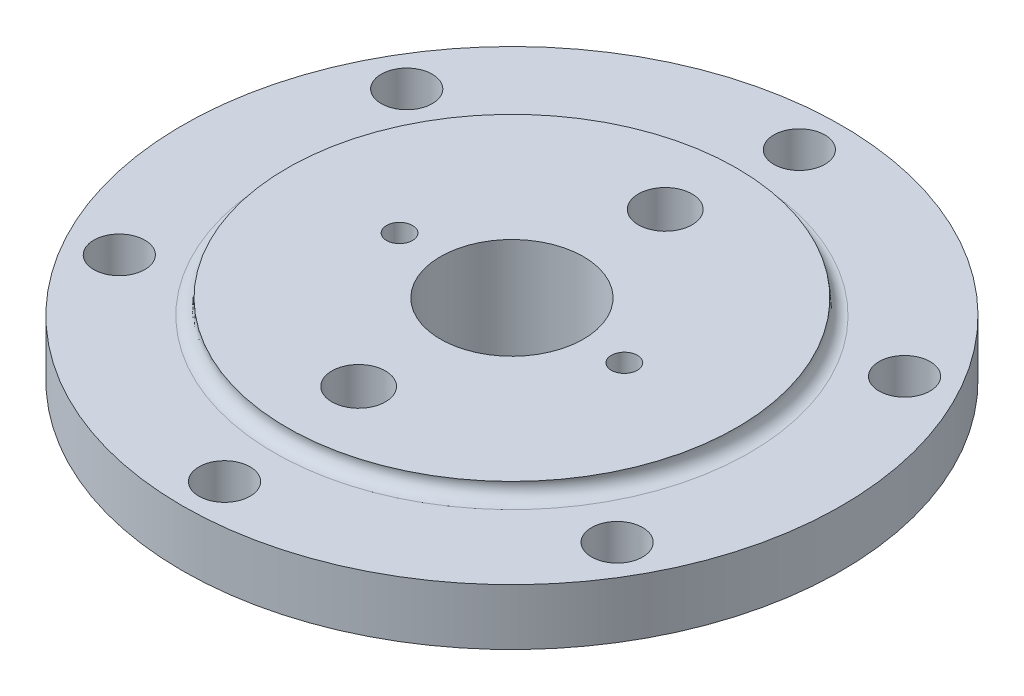
ISO-10303-21;
HEADER;
FILE_DESCRIPTION(('STEP AP214'),'2;1');
FILE_NAME('part.step','',(''),(''),'','','');
FILE_SCHEMA(('AUTOMOTIVE_DESIGN { 1 0 10303 214 1 1 1 1 }'));
ENDSEC;
DATA;
#1=APPLICATION_CONTEXT('core data for automotive mechanical design processes');
#2=APPLICATION_PROTOCOL_DEFINITION('international standard','automotive_design',2000,#1);
#3=PRODUCT_CONTEXT('',#1,'mechanical');
#4=PRODUCT('Part','Part','',(#3));
#5=PRODUCT_RELATED_PRODUCT_CATEGORY('part','',(#4));
#6=PRODUCT_DEFINITION_FORMATION('','',#4);
#7=PRODUCT_DEFINITION_CONTEXT('part definition',#1,'design');
#8=PRODUCT_DEFINITION('design','',#6,#7);
#9=PRODUCT_DEFINITION_SHAPE('','',#8);
#10=(LENGTH_UNIT() NAMED_UNIT(*) SI_UNIT(.MILLI.,.METRE.));
#11=(NAMED_UNIT(*) PLANE_ANGLE_UNIT() SI_UNIT($,.RADIAN.));
#12=(NAMED_UNIT(*) SI_UNIT($,.STERADIAN.) SOLID_ANGLE_UNIT());
#13=UNCERTAINTY_MEASURE_WITH_UNIT(LENGTH_MEASURE(1.E-05),#10,'distance_accuracy_value','');
#14=(GEOMETRIC_REPRESENTATION_CONTEXT(3) GLOBAL_UNCERTAINTY_ASSIGNED_CONTEXT((#13)) GLOBAL_UNIT_ASSIGNED_CONTEXT((#10,
#11,#12)) REPRESENTATION_CONTEXT('',''));
#15=CARTESIAN_POINT('',(0.,0.,0.));
#16=DIRECTION('',(0.,0.,1.));
#17=DIRECTION('',(1.,0.,0.));
#18=AXIS2_PLACEMENT_3D('',#15,#16,#17);
#19=CARTESIAN_POINT('',(0.,75.,-138.));
#20=DIRECTION('',(0.,1.,0.));
#21=DIRECTION('',(0.,0.,1.));
#22=AXIS2_PLACEMENT_3D('',#19,#20,#21);
#23=PLANE('',#22);
#24=CARTESIAN_POINT('',(0.,75.,0.));
#25=DIRECTION('',(0.,-1.,0.));
#26=DIRECTION('',(0.,0.,-1.));
#27=AXIS2_PLACEMENT_3D('',#24,#25,#26);
#28=CIRCLE('',#27,93.0283609407576);
#29=CARTESIAN_POINT('',(0.,75.,-93.0283609407576));
#30=VERTEX_POINT('',#29);
#31=EDGE_CURVE('E128',#30,#30,#28,.T.);
#32=ORIENTED_EDGE('',*,*,#31,.T.);
#33=EDGE_LOOP('',(#32));
#34=FACE_BOUND('',#33,.T.);
#35=CARTESIAN_POINT('',(0.,75.,-112.5));
#36=DIRECTION('',(0.,1.,0.));
#37=DIRECTION('',(0.,0.,1.));
#38=AXIS2_PLACEMENT_3D('',#35,#36,#37);
#39=CIRCLE('',#38,10.);
#40=CARTESIAN_POINT('',(0.,75.,-102.5));
#41=VERTEX_POINT('',#40);
#42=EDGE_CURVE('E111',#41,#41,#39,.T.);
#43=ORIENTED_EDGE('',*,*,#42,.F.);
#44=EDGE_LOOP('',(#43));
#45=FACE_BOUND('',#44,.T.);
#46=CARTESIAN_POINT('',(-97.4278579257478,75.,-56.2499999999972));
#47=DIRECTION('',(0.,1.,0.));
#48=DIRECTION('',(0.,0.,1.));
#49=AXIS2_PLACEMENT_3D('',#46,#47,#48);
#50=CIRCLE('',#49,10.0000000000037);
#51=CARTESIAN_POINT('',(-97.4278579257478,75.,-46.2499999999935));
#52=VERTEX_POINT('',#51);
#53=EDGE_CURVE('E95',#52,#52,#50,.T.);
#54=ORIENTED_EDGE('',*,*,#53,.F.);
#55=EDGE_LOOP('',(#54));
#56=FACE_BOUND('',#55,.T.);
#57=CARTESIAN_POINT('',(-97.4278579257446,75.,56.2500000000028));
#58=DIRECTION('',(0.,1.,0.));
#59=DIRECTION('',(0.,0.,1.));
#60=AXIS2_PLACEMENT_3D('',#57,#58,#59);
#61=CIRCLE('',#60,10.0000000000064);
#62=CARTESIAN_POINT('',(-97.4278579257446,75.,66.2500000000092));
#63=VERTEX_POINT('',#62);
#64=EDGE_CURVE('E106',#63,#63,#61,.T.);
#65=ORIENTED_EDGE('',*,*,#64,.F.);
#66=EDGE_LOOP('',(#65));
#67=FACE_BOUND('',#66,.T.);
#68=CARTESIAN_POINT('',(6.36733006886009E-12,75.,112.5));
#69=DIRECTION('',(0.,1.,0.));
#70=DIRECTION('',(0.,0.,1.));
#71=AXIS2_PLACEMENT_3D('',#68,#69,#70);
#72=CIRCLE('',#71,10.0000000000068);
#73=CARTESIAN_POINT('',(6.36733006886009E-12,75.,122.500000000007));
#74=VERTEX_POINT('',#73);
#75=EDGE_CURVE('E103',#74,#74,#72,.T.);
#76=ORIENTED_EDGE('',*,*,#75,.F.);
#77=EDGE_LOOP('',(#76));
#78=FACE_BOUND('',#77,.T.);
#79=CARTESIAN_POINT('',(97.4278579257541,75.,56.2499999999972));
#80=DIRECTION('',(0.,1.,0.));
#81=DIRECTION('',(0.,0.,1.));
#82=AXIS2_PLACEMENT_3D('',#79,#80,#81);
#83=CIRCLE('',#82,10.0000000000043);
#84=CARTESIAN_POINT('',(97.4278579257541,75.,66.2500000000015));
#85=VERTEX_POINT('',#84);
#86=EDGE_CURVE('E100',#85,#85,#83,.T.);
#87=ORIENTED_EDGE('',*,*,#86,.F.);
#88=EDGE_LOOP('',(#87));
#89=FACE_BOUND('',#88,.T.);
#90=CARTESIAN_POINT('',(97.4278579257509,75.,-56.2500000000028));
#91=DIRECTION('',(0.,1.,0.));
#92=DIRECTION('',(0.,0.,1.));
#93=AXIS2_PLACEMENT_3D('',#90,#91,#92);
#94=CIRCLE('',#93,10.000000000001);
#95=CARTESIAN_POINT('',(97.4278579257509,75.,-46.2500000000018));
#96=VERTEX_POINT('',#95);
#97=EDGE_CURVE('E96',#96,#96,#94,.T.);
#98=ORIENTED_EDGE('',*,*,#97,.F.);
#99=EDGE_LOOP('',(#98));
#100=FACE_BOUND('',#99,.T.);
#101=CARTESIAN_POINT('',(0.,75.,0.));
#102=DIRECTION('',(0.,1.,0.));
#103=DIRECTION('',(0.,0.,1.));
#104=AXIS2_PLACEMENT_3D('',#101,#102,#103);
#105=CIRCLE('',#104,129.);
#106=CARTESIAN_POINT('',(0.,75.,129.));
#107=VERTEX_POINT('',#106);
#108=EDGE_CURVE('E77',#107,#107,#105,.T.);
#109=ORIENTED_EDGE('',*,*,#108,.T.);
#110=EDGE_LOOP('',(#109));
#111=FACE_BOUND('',#110,.T.);
#112=ADVANCED_FACE('F37',(#34,#45,#56,#67,#78,#89,#100,#111),#23,.T.);
#113=CARTESIAN_POINT('',(0.,53.,-81.));
#114=DIRECTION('',(0.,-1.,0.));
#115=DIRECTION('',(0.,0.,-1.));
#116=AXIS2_PLACEMENT_3D('',#113,#114,#115);
#117=PLANE('',#116);
#118=CARTESIAN_POINT('',(0.,53.,0.));
#119=DIRECTION('',(0.,-1.,0.));
#120=DIRECTION('',(0.,0.,-1.));
#121=AXIS2_PLACEMENT_3D('',#118,#119,#120);
#122=CIRCLE('',#121,81.);
#123=CARTESIAN_POINT('',(0.,53.,-81.));
#124=VERTEX_POINT('',#123);
#125=EDGE_CURVE('E125',#124,#124,#122,.T.);
#126=ORIENTED_EDGE('',*,*,#125,.F.);
#127=EDGE_LOOP('',(#126));
#128=FACE_BOUND('',#127,.T.);
#129=CARTESIAN_POINT('',(0.,53.,-112.5));
#130=DIRECTION('',(0.,-1.,0.));
#131=DIRECTION('',(0.,0.,-1.));
#132=AXIS2_PLACEMENT_3D('',#129,#130,#131);
#133=CIRCLE('',#132,10.);
#134=CARTESIAN_POINT('',(0.,53.,-122.5));
#135=VERTEX_POINT('',#134);
#136=EDGE_CURVE('E114',#135,#135,#133,.T.);
#137=ORIENTED_EDGE('',*,*,#136,.F.);
#138=EDGE_LOOP('',(#137));
#139=FACE_BOUND('',#138,.T.);
#140=CARTESIAN_POINT('',(-97.4278579257478,53.,-56.2499999999972));
#141=DIRECTION('',(0.,-1.,0.));
#142=DIRECTION('',(0.,0.,-1.));
#143=AXIS2_PLACEMENT_3D('',#140,#141,#142);
#144=CIRCLE('',#143,10.0000000000037);
#145=CARTESIAN_POINT('',(-97.4278579257478,53.,-66.2500000000009));
#146=VERTEX_POINT('',#145);
#147=EDGE_CURVE('E99',#146,#146,#144,.T.);
#148=ORIENTED_EDGE('',*,*,#147,.F.);
#149=EDGE_LOOP('',(#148));
#150=FACE_BOUND('',#149,.T.);
#151=CARTESIAN_POINT('',(-97.4278579257446,53.,56.2500000000028));
#152=DIRECTION('',(0.,-1.,0.));
#153=DIRECTION('',(0.,0.,-1.));
#154=AXIS2_PLACEMENT_3D('',#151,#152,#153);
#155=CIRCLE('',#154,10.0000000000064);
#156=CARTESIAN_POINT('',(-97.4278579257446,53.,46.2499999999964));
#157=VERTEX_POINT('',#156);
#158=EDGE_CURVE('E143',#157,#157,#155,.T.);
#159=ORIENTED_EDGE('',*,*,#158,.F.);
#160=EDGE_LOOP('',(#159));
#161=FACE_BOUND('',#160,.T.);
#162=CARTESIAN_POINT('',(6.36733006886009E-12,53.,112.5));
#163=DIRECTION('',(0.,-1.,0.));
#164=DIRECTION('',(0.,0.,-1.));
#165=AXIS2_PLACEMENT_3D('',#162,#163,#164);
#166=CIRCLE('',#165,10.0000000000068);
#167=CARTESIAN_POINT('',(6.36733006886009E-12,53.,102.499999999993));
#168=VERTEX_POINT('',#167);
#169=EDGE_CURVE('E146',#168,#168,#166,.T.);
#170=ORIENTED_EDGE('',*,*,#169,.F.);
#171=EDGE_LOOP('',(#170));
#172=FACE_BOUND('',#171,.T.);
#173=CARTESIAN_POINT('',(97.4278579257541,53.,56.2499999999972));
#174=DIRECTION('',(0.,-1.,0.));
#175=DIRECTION('',(0.,0.,-1.));
#176=AXIS2_PLACEMENT_3D('',#173,#174,#175);
#177=CIRCLE('',#176,10.0000000000043);
#178=CARTESIAN_POINT('',(97.4278579257541,53.,46.2499999999929));
#179=VERTEX_POINT('',#178);
#180=EDGE_CURVE('E149',#179,#179,#177,.T.);
#181=ORIENTED_EDGE('',*,*,#180,.F.);
#182=EDGE_LOOP('',(#181));
#183=FACE_BOUND('',#182,.T.);
#184=CARTESIAN_POINT('',(97.4278579257509,53.,-56.2500000000028));
#185=DIRECTION('',(0.,-1.,0.));
#186=DIRECTION('',(0.,0.,-1.));
#187=AXIS2_PLACEMENT_3D('',#184,#185,#186);
#188=CIRCLE('',#187,10.000000000001);
#189=CARTESIAN_POINT('',(97.4278579257509,53.,-66.2500000000038));
#190=VERTEX_POINT('',#189);
#191=EDGE_CURVE('E115',#190,#190,#188,.T.);
#192=ORIENTED_EDGE('',*,*,#191,.F.);
#193=EDGE_LOOP('',(#192));
#194=FACE_BOUND('',#193,.T.);
#195=CARTESIAN_POINT('',(0.,53.,0.));
#196=DIRECTION('',(0.,-1.,0.));
#197=DIRECTION('',(0.,0.,-1.));
#198=AXIS2_PLACEMENT_3D('',#195,#196,#197);
#199=CIRCLE('',#198,129.);
#200=CARTESIAN_POINT('',(0.,53.,129.));
#201=VERTEX_POINT('',#200);
#202=EDGE_CURVE('E41',#201,#201,#199,.T.);
#203=ORIENTED_EDGE('',*,*,#202,.T.);
#204=EDGE_LOOP('',(#203));
#205=FACE_BOUND('',#204,.T.);
#206=ADVANCED_FACE('F157',(#128,#139,#150,#161,#172,#183,#194,#205),#117,.T.);
#207=CARTESIAN_POINT('',(0.,0.,0.));
#208=DIRECTION('',(0.,-1.,0.));
#209=DIRECTION('',(0.,0.,-1.));
#210=AXIS2_PLACEMENT_3D('',#207,#208,#209);
#211=CYLINDRICAL_SURFACE('',#210,14.);
#212=CARTESIAN_POINT('',(0.,0.,0.));
#213=DIRECTION('',(0.,-1.,0.));
#214=DIRECTION('',(0.,0.,-1.));
#215=AXIS2_PLACEMENT_3D('',#212,#213,#214);
#216=CIRCLE('',#215,14.);
#217=CARTESIAN_POINT('',(0.,0.,-14.));
#218=VERTEX_POINT('',#217);
#219=EDGE_CURVE('E116',#218,#218,#216,.T.);
#220=ORIENTED_EDGE('',*,*,#219,.T.);
#221=EDGE_LOOP('',(#220));
#222=FACE_BOUND('',#221,.T.);
#223=CARTESIAN_POINT('',(0.,27.,0.));
#224=DIRECTION('',(0.,-1.,0.));
#225=DIRECTION('',(0.,0.,-1.));
#226=AXIS2_PLACEMENT_3D('',#223,#224,#225);
#227=CIRCLE('',#226,14.);
#228=CARTESIAN_POINT('',(0.,27.,-14.));
#229=VERTEX_POINT('',#228);
#230=EDGE_CURVE('E11',#229,#229,#227,.T.);
#231=ORIENTED_EDGE('',*,*,#230,.F.);
#232=EDGE_LOOP('',(#231));
#233=FACE_BOUND('',#232,.T.);
#234=ADVANCED_FACE('F39',(#222,#233),#211,.F.);
#235=CARTESIAN_POINT('',(0.,35.0829037686549,0.));
#236=DIRECTION('',(0.,1.,0.));
#237=DIRECTION('',(0.,0.,1.));
#238=AXIS2_PLACEMENT_3D('',#235,#236,#237);
#239=CONICAL_SURFACE('',#238,28.,1.04719755119659);
#240=ORIENTED_EDGE('',*,*,#230,.T.);
#241=EDGE_LOOP('',(#240));
#242=FACE_BOUND('',#241,.T.);
#243=CARTESIAN_POINT('',(0.,35.0829037686549,0.));
#244=DIRECTION('',(0.,-1.,0.));
#245=DIRECTION('',(0.,0.,-1.));
#246=AXIS2_PLACEMENT_3D('',#243,#244,#245);
#247=CIRCLE('',#246,28.);
#248=CARTESIAN_POINT('',(0.,35.0829037686549,-28.));
#249=VERTEX_POINT('',#248);
#250=EDGE_CURVE('E46',#249,#249,#247,.T.);
#251=ORIENTED_EDGE('',*,*,#250,.F.);
#252=EDGE_LOOP('',(#251));
#253=FACE_BOUND('',#252,.T.);
#254=ADVANCED_FACE('F195',(#242,#253),#239,.F.);
#255=CARTESIAN_POINT('',(0.,0.,0.));
#256=DIRECTION('',(0.,-1.,0.));
#257=DIRECTION('',(0.,0.,-1.));
#258=AXIS2_PLACEMENT_3D('',#255,#256,#257);
#259=CYLINDRICAL_SURFACE('',#258,28.);
#260=ORIENTED_EDGE('',*,*,#250,.T.);
#261=EDGE_LOOP('',(#260));
#262=FACE_BOUND('',#261,.T.);
#263=CARTESIAN_POINT('',(0.,81.,0.));
#264=DIRECTION('',(0.,-1.,0.));
#265=DIRECTION('',(0.,0.,-1.));
#266=AXIS2_PLACEMENT_3D('',#263,#264,#265);
#267=CIRCLE('',#266,28.);
#268=CARTESIAN_POINT('',(0.,81.,-28.));
#269=VERTEX_POINT('',#268);
#270=EDGE_CURVE('E134',#269,#269,#267,.T.);
#271=ORIENTED_EDGE('',*,*,#270,.F.);
#272=EDGE_LOOP('',(#271));
#273=FACE_BOUND('',#272,.T.);
#274=ADVANCED_FACE('F192',(#262,#273),#259,.F.);
#275=CARTESIAN_POINT('',(0.,81.,-88.));
#276=DIRECTION('',(0.,1.,0.));
#277=DIRECTION('',(0.,0.,1.));
#278=AXIS2_PLACEMENT_3D('',#275,#276,#277);
#279=PLANE('',#278);
#280=CARTESIAN_POINT('',(-44.,81.,0.));
#281=DIRECTION('',(0.,1.,0.));
#282=DIRECTION('',(0.,0.,1.));
#283=AXIS2_PLACEMENT_3D('',#280,#281,#282);
#284=CIRCLE('',#283,5.09999999999999);
#285=CARTESIAN_POINT('',(-44.,81.,5.09999999999999));
#286=VERTEX_POINT('',#285);
#287=EDGE_CURVE('E71',#286,#286,#284,.T.);
#288=ORIENTED_EDGE('',*,*,#287,.F.);
#289=EDGE_LOOP('',(#288));
#290=FACE_BOUND('',#289,.T.);
#291=CARTESIAN_POINT('',(44.,81.,0.));
#292=DIRECTION('',(0.,1.,0.));
#293=DIRECTION('',(0.,0.,1.));
#294=AXIS2_PLACEMENT_3D('',#291,#292,#293);
#295=CIRCLE('',#294,5.09999999999999);
#296=CARTESIAN_POINT('',(44.,81.,5.09999999999998));
#297=VERTEX_POINT('',#296);
#298=EDGE_CURVE('E70',#297,#297,#295,.T.);
#299=ORIENTED_EDGE('',*,*,#298,.F.);
#300=EDGE_LOOP('',(#299));
#301=FACE_BOUND('',#300,.T.);
#302=CARTESIAN_POINT('',(0.,81.,-60.));
#303=DIRECTION('',(0.,1.,0.));
#304=DIRECTION('',(0.,0.,1.));
#305=AXIS2_PLACEMENT_3D('',#302,#303,#304);
#306=CIRCLE('',#305,10.5);
#307=CARTESIAN_POINT('',(0.,81.,-49.5));
#308=VERTEX_POINT('',#307);
#309=EDGE_CURVE('E83',#308,#308,#306,.T.);
#310=ORIENTED_EDGE('',*,*,#309,.F.);
#311=EDGE_LOOP('',(#310));
#312=FACE_BOUND('',#311,.T.);
#313=CARTESIAN_POINT('',(0.,81.,60.));
#314=DIRECTION('',(0.,1.,0.));
#315=DIRECTION('',(0.,0.,1.));
#316=AXIS2_PLACEMENT_3D('',#313,#314,#315);
#317=CIRCLE('',#316,10.5);
#318=CARTESIAN_POINT('',(0.,81.,70.5));
#319=VERTEX_POINT('',#318);
#320=EDGE_CURVE('E89',#319,#319,#317,.T.);
#321=ORIENTED_EDGE('',*,*,#320,.F.);
#322=EDGE_LOOP('',(#321));
#323=FACE_BOUND('',#322,.T.);
#324=ORIENTED_EDGE('',*,*,#270,.T.);
#325=EDGE_LOOP('',(#324));
#326=FACE_BOUND('',#325,.T.);
#327=CARTESIAN_POINT('',(0.,81.,0.));
#328=DIRECTION('',(0.,-1.,0.));
#329=DIRECTION('',(0.,0.,-1.));
#330=AXIS2_PLACEMENT_3D('',#327,#328,#329);
#331=CIRCLE('',#330,88.);
#332=CARTESIAN_POINT('',(0.,81.,-88.));
#333=VERTEX_POINT('',#332);
#334=EDGE_CURVE('E131',#333,#333,#331,.T.);
#335=ORIENTED_EDGE('',*,*,#334,.F.);
#336=EDGE_LOOP('',(#335));
#337=FACE_BOUND('',#336,.T.);
#338=ADVANCED_FACE('F188',(#290,#301,#312,#323,#326,#337),#279,.T.);
#339=CARTESIAN_POINT('',(0.,80.1070344792114,0.));
#340=DIRECTION('',(0.,-1.,0.));
#341=DIRECTION('',(0.,0.,-1.));
#342=AXIS2_PLACEMENT_3D('',#339,#340,#341);
#343=TOROIDAL_SURFACE('',#342,93.0283609407576,5.10703447921137);
#344=ORIENTED_EDGE('',*,*,#334,.T.);
#345=EDGE_LOOP('',(#344));
#346=FACE_BOUND('',#345,.T.);
#347=ORIENTED_EDGE('',*,*,#31,.F.);
#348=EDGE_LOOP('',(#347));
#349=FACE_BOUND('',#348,.T.);
#350=ADVANCED_FACE('F184',(#346,#349),#343,.F.);
#351=CARTESIAN_POINT('',(0.,0.,0.));
#352=DIRECTION('',(0.,-1.,0.));
#353=DIRECTION('',(0.,0.,-1.));
#354=AXIS2_PLACEMENT_3D('',#351,#352,#353);
#355=CYLINDRICAL_SURFACE('',#354,81.);
#356=ORIENTED_EDGE('',*,*,#125,.T.);
#357=EDGE_LOOP('',(#356));
#358=FACE_BOUND('',#357,.T.);
#359=CARTESIAN_POINT('',(0.,47.,0.));
#360=DIRECTION('',(0.,-1.,0.));
#361=DIRECTION('',(0.,0.,-1.));
#362=AXIS2_PLACEMENT_3D('',#359,#360,#361);
#363=CIRCLE('',#362,81.);
#364=CARTESIAN_POINT('',(0.,47.,-81.));
#365=VERTEX_POINT('',#364);
#366=EDGE_CURVE('E122',#365,#365,#363,.T.);
#367=ORIENTED_EDGE('',*,*,#366,.F.);
#368=EDGE_LOOP('',(#367));
#369=FACE_BOUND('',#368,.T.);
#370=ADVANCED_FACE('F187',(#358,#369),#355,.T.);
#371=CARTESIAN_POINT('',(0.,0.,0.));
#372=DIRECTION('',(0.,1.,0.));
#373=DIRECTION('',(0.,0.,1.));
#374=AXIS2_PLACEMENT_3D('',#371,#372,#373);
#375=CONICAL_SURFACE('',#374,35.,0.774645889606347);
#376=ORIENTED_EDGE('',*,*,#366,.T.);
#377=EDGE_LOOP('',(#376));
#378=FACE_BOUND('',#377,.T.);
#379=CARTESIAN_POINT('',(0.,0.,0.));
#380=DIRECTION('',(0.,-1.,0.));
#381=DIRECTION('',(0.,0.,-1.));
#382=AXIS2_PLACEMENT_3D('',#379,#380,#381);
#383=CIRCLE('',#382,35.);
#384=CARTESIAN_POINT('',(0.,0.,-35.));
#385=VERTEX_POINT('',#384);
#386=EDGE_CURVE('E119',#385,#385,#383,.T.);
#387=ORIENTED_EDGE('',*,*,#386,.F.);
#388=EDGE_LOOP('',(#387));
#389=FACE_BOUND('',#388,.T.);
#390=ADVANCED_FACE('F221',(#378,#389),#375,.T.);
#391=CARTESIAN_POINT('',(0.,0.,-14.));
#392=DIRECTION('',(0.,-1.,0.));
#393=DIRECTION('',(0.,0.,-1.));
#394=AXIS2_PLACEMENT_3D('',#391,#392,#393);
#395=PLANE('',#394);
#396=ORIENTED_EDGE('',*,*,#386,.T.);
#397=EDGE_LOOP('',(#396));
#398=FACE_BOUND('',#397,.T.);
#399=ORIENTED_EDGE('',*,*,#219,.F.);
#400=EDGE_LOOP('',(#399));
#401=FACE_BOUND('',#400,.T.);
#402=ADVANCED_FACE('F218',(#398,#401),#395,.T.);
#403=CARTESIAN_POINT('',(0.,0.,-112.5));
#404=DIRECTION('',(0.,1.,0.));
#405=DIRECTION('',(0.,0.,1.));
#406=AXIS2_PLACEMENT_3D('',#403,#404,#405);
#407=CYLINDRICAL_SURFACE('',#406,10.);
#408=ORIENTED_EDGE('',*,*,#136,.T.);
#409=EDGE_LOOP('',(#408));
#410=FACE_BOUND('',#409,.T.);
#411=ORIENTED_EDGE('',*,*,#42,.T.);
#412=EDGE_LOOP('',(#411));
#413=FACE_BOUND('',#412,.T.);
#414=ADVANCED_FACE('F220',(#410,#413),#407,.F.);
#415=CARTESIAN_POINT('',(-97.4278579257478,0.,-56.2499999999972));
#416=DIRECTION('',(0.,1.,0.));
#417=DIRECTION('',(0.,0.,1.));
#418=AXIS2_PLACEMENT_3D('',#415,#416,#417);
#419=CYLINDRICAL_SURFACE('',#418,10.0000000000037);
#420=ORIENTED_EDGE('',*,*,#147,.T.);
#421=EDGE_LOOP('',(#420));
#422=FACE_BOUND('',#421,.T.);
#423=ORIENTED_EDGE('',*,*,#53,.T.);
#424=EDGE_LOOP('',(#423));
#425=FACE_BOUND('',#424,.T.);
#426=ADVANCED_FACE('F228',(#422,#425),#419,.F.);
#427=CARTESIAN_POINT('',(-97.4278579257446,0.,56.2500000000028));
#428=DIRECTION('',(0.,1.,0.));
#429=DIRECTION('',(0.,0.,1.));
#430=AXIS2_PLACEMENT_3D('',#427,#428,#429);
#431=CYLINDRICAL_SURFACE('',#430,10.0000000000064);
#432=ORIENTED_EDGE('',*,*,#158,.T.);
#433=EDGE_LOOP('',(#432));
#434=FACE_BOUND('',#433,.T.);
#435=ORIENTED_EDGE('',*,*,#64,.T.);
#436=EDGE_LOOP('',(#435));
#437=FACE_BOUND('',#436,.T.);
#438=ADVANCED_FACE('F275',(#434,#437),#431,.F.);
#439=CARTESIAN_POINT('',(6.36733006886009E-12,0.,112.5));
#440=DIRECTION('',(0.,1.,0.));
#441=DIRECTION('',(0.,0.,1.));
#442=AXIS2_PLACEMENT_3D('',#439,#440,#441);
#443=CYLINDRICAL_SURFACE('',#442,10.0000000000068);
#444=ORIENTED_EDGE('',*,*,#169,.T.);
#445=EDGE_LOOP('',(#444));
#446=FACE_BOUND('',#445,.T.);
#447=ORIENTED_EDGE('',*,*,#75,.T.);
#448=EDGE_LOOP('',(#447));
#449=FACE_BOUND('',#448,.T.);
#450=ADVANCED_FACE('F257',(#446,#449),#443,.F.);
#451=CARTESIAN_POINT('',(97.4278579257541,0.,56.2499999999972));
#452=DIRECTION('',(0.,1.,0.));
#453=DIRECTION('',(0.,0.,1.));
#454=AXIS2_PLACEMENT_3D('',#451,#452,#453);
#455=CYLINDRICAL_SURFACE('',#454,10.0000000000043);
#456=ORIENTED_EDGE('',*,*,#180,.T.);
#457=EDGE_LOOP('',(#456));
#458=FACE_BOUND('',#457,.T.);
#459=ORIENTED_EDGE('',*,*,#86,.T.);
#460=EDGE_LOOP('',(#459));
#461=FACE_BOUND('',#460,.T.);
#462=ADVANCED_FACE('F254',(#458,#461),#455,.F.);
#463=CARTESIAN_POINT('',(97.4278579257509,0.,-56.2500000000028));
#464=DIRECTION('',(0.,1.,0.));
#465=DIRECTION('',(0.,0.,1.));
#466=AXIS2_PLACEMENT_3D('',#463,#464,#465);
#467=CYLINDRICAL_SURFACE('',#466,10.000000000001);
#468=ORIENTED_EDGE('',*,*,#191,.T.);
#469=EDGE_LOOP('',(#468));
#470=FACE_BOUND('',#469,.T.);
#471=ORIENTED_EDGE('',*,*,#97,.T.);
#472=EDGE_LOOP('',(#471));
#473=FACE_BOUND('',#472,.T.);
#474=ADVANCED_FACE('F154',(#470,#473),#467,.F.);
#475=CARTESIAN_POINT('',(0.,54.,60.));
#476=DIRECTION('',(0.,1.,0.));
#477=DIRECTION('',(0.,0.,1.));
#478=AXIS2_PLACEMENT_3D('',#475,#476,#477);
#479=CONICAL_SURFACE('',#478,10.5,1.02974425867665);
#480=CARTESIAN_POINT('',(0.,47.6909635002106,60.));
#481=VERTEX_POINT('',#480);
#482=VERTEX_LOOP('',#481);
#483=FACE_BOUND('',#482,.T.);
#484=CARTESIAN_POINT('',(0.,54.,60.));
#485=DIRECTION('',(0.,1.,0.));
#486=DIRECTION('',(0.,0.,1.));
#487=AXIS2_PLACEMENT_3D('',#484,#485,#486);
#488=CIRCLE('',#487,10.5);
#489=CARTESIAN_POINT('',(0.,54.,70.5));
#490=VERTEX_POINT('',#489);
#491=EDGE_CURVE('E92',#490,#490,#488,.T.);
#492=ORIENTED_EDGE('',*,*,#491,.T.);
#493=EDGE_LOOP('',(#492));
#494=FACE_BOUND('',#493,.T.);
#495=ADVANCED_FACE('F264',(#483,#494),#479,.F.);
#496=CARTESIAN_POINT('',(0.,81.,60.));
#497=DIRECTION('',(0.,1.,0.));
#498=DIRECTION('',(0.,0.,1.));
#499=AXIS2_PLACEMENT_3D('',#496,#497,#498);
#500=CYLINDRICAL_SURFACE('',#499,10.5);
#501=ORIENTED_EDGE('',*,*,#491,.F.);
#502=EDGE_LOOP('',(#501));
#503=FACE_BOUND('',#502,.T.);
#504=ORIENTED_EDGE('',*,*,#320,.T.);
#505=EDGE_LOOP('',(#504));
#506=FACE_BOUND('',#505,.T.);
#507=ADVANCED_FACE('F269',(#503,#506),#500,.F.);
#508=CARTESIAN_POINT('',(0.,54.,-60.));
#509=DIRECTION('',(0.,1.,0.));
#510=DIRECTION('',(0.,0.,1.));
#511=AXIS2_PLACEMENT_3D('',#508,#509,#510);
#512=CONICAL_SURFACE('',#511,10.5,1.02974425867665);
#513=CARTESIAN_POINT('',(0.,47.6909635002106,-60.));
#514=VERTEX_POINT('',#513);
#515=VERTEX_LOOP('',#514);
#516=FACE_BOUND('',#515,.T.);
#517=CARTESIAN_POINT('',(0.,54.,-60.));
#518=DIRECTION('',(0.,1.,0.));
#519=DIRECTION('',(0.,0.,1.));
#520=AXIS2_PLACEMENT_3D('',#517,#518,#519);
#521=CIRCLE('',#520,10.5);
#522=CARTESIAN_POINT('',(0.,54.,-49.5));
#523=VERTEX_POINT('',#522);
#524=EDGE_CURVE('E86',#523,#523,#521,.T.);
#525=ORIENTED_EDGE('',*,*,#524,.T.);
#526=EDGE_LOOP('',(#525));
#527=FACE_BOUND('',#526,.T.);
#528=ADVANCED_FACE('F326',(#516,#527),#512,.F.);
#529=CARTESIAN_POINT('',(0.,81.,-60.));
#530=DIRECTION('',(0.,1.,0.));
#531=DIRECTION('',(0.,0.,1.));
#532=AXIS2_PLACEMENT_3D('',#529,#530,#531);
#533=CYLINDRICAL_SURFACE('',#532,10.5);
#534=ORIENTED_EDGE('',*,*,#524,.F.);
#535=EDGE_LOOP('',(#534));
#536=FACE_BOUND('',#535,.T.);
#537=ORIENTED_EDGE('',*,*,#309,.T.);
#538=EDGE_LOOP('',(#537));
#539=FACE_BOUND('',#538,.T.);
#540=ADVANCED_FACE('F337',(#536,#539),#533,.F.);
#541=CARTESIAN_POINT('',(44.,66.,0.));
#542=DIRECTION('',(0.,1.,0.));
#543=DIRECTION('',(0.,0.,1.));
#544=AXIS2_PLACEMENT_3D('',#541,#542,#543);
#545=CONICAL_SURFACE('',#544,5.09999999999999,1.02974425867665);
#546=CARTESIAN_POINT('',(44.,62.9356108429594,0.));
#547=VERTEX_POINT('',#546);
#548=VERTEX_LOOP('',#547);
#549=FACE_BOUND('',#548,.T.);
#550=CARTESIAN_POINT('',(44.,66.,0.));
#551=DIRECTION('',(0.,1.,0.));
#552=DIRECTION('',(0.,0.,1.));
#553=AXIS2_PLACEMENT_3D('',#550,#551,#552);
#554=CIRCLE('',#553,5.09999999999999);
#555=CARTESIAN_POINT('',(44.,66.,5.09999999999998));
#556=VERTEX_POINT('',#555);
#557=EDGE_CURVE('E74',#556,#556,#554,.T.);
#558=ORIENTED_EDGE('',*,*,#557,.T.);
#559=EDGE_LOOP('',(#558));
#560=FACE_BOUND('',#559,.T.);
#561=ADVANCED_FACE('F346',(#549,#560),#545,.F.);
#562=CARTESIAN_POINT('',(44.,81.,0.));
#563=DIRECTION('',(0.,1.,0.));
#564=DIRECTION('',(0.,0.,1.));
#565=AXIS2_PLACEMENT_3D('',#562,#563,#564);
#566=CYLINDRICAL_SURFACE('',#565,5.09999999999999);
#567=ORIENTED_EDGE('',*,*,#557,.F.);
#568=EDGE_LOOP('',(#567));
#569=FACE_BOUND('',#568,.T.);
#570=ORIENTED_EDGE('',*,*,#298,.T.);
#571=EDGE_LOOP('',(#570));
#572=FACE_BOUND('',#571,.T.);
#573=ADVANCED_FACE('F64',(#569,#572),#566,.F.);
#574=CARTESIAN_POINT('',(-44.,66.,0.));
#575=DIRECTION('',(0.,1.,0.));
#576=DIRECTION('',(0.,0.,1.));
#577=AXIS2_PLACEMENT_3D('',#574,#575,#576);
#578=CONICAL_SURFACE('',#577,5.09999999999999,1.02974425867665);
#579=CARTESIAN_POINT('',(-44.,62.9356108429594,0.));
#580=VERTEX_POINT('',#579);
#581=VERTEX_LOOP('',#580);
#582=FACE_BOUND('',#581,.T.);
#583=CARTESIAN_POINT('',(-44.,66.,0.));
#584=DIRECTION('',(0.,1.,0.));
#585=DIRECTION('',(0.,0.,1.));
#586=AXIS2_PLACEMENT_3D('',#583,#584,#585);
#587=CIRCLE('',#586,5.09999999999999);
#588=CARTESIAN_POINT('',(-44.,66.,5.09999999999999));
#589=VERTEX_POINT('',#588);
#590=EDGE_CURVE('E68',#589,#589,#587,.T.);
#591=ORIENTED_EDGE('',*,*,#590,.T.);
#592=EDGE_LOOP('',(#591));
#593=FACE_BOUND('',#592,.T.);
#594=ADVANCED_FACE('F60',(#582,#593),#578,.F.);
#595=CARTESIAN_POINT('',(-44.,81.,0.));
#596=DIRECTION('',(0.,1.,0.));
#597=DIRECTION('',(0.,0.,1.));
#598=AXIS2_PLACEMENT_3D('',#595,#596,#597);
#599=CYLINDRICAL_SURFACE('',#598,5.09999999999999);
#600=ORIENTED_EDGE('',*,*,#590,.F.);
#601=EDGE_LOOP('',(#600));
#602=FACE_BOUND('',#601,.T.);
#603=ORIENTED_EDGE('',*,*,#287,.T.);
#604=EDGE_LOOP('',(#603));
#605=FACE_BOUND('',#604,.T.);
#606=ADVANCED_FACE('F63',(#602,#605),#599,.F.);
#607=CARTESIAN_POINT('',(0.,20.,0.));
#608=DIRECTION('',(0.,1.,0.));
#609=DIRECTION('',(0.,0.,1.));
#610=AXIS2_PLACEMENT_3D('',#607,#608,#609);
#611=CYLINDRICAL_SURFACE('',#610,129.);
#612=CARTESIAN_POINT('',(0.,75.,129.));
#613=CARTESIAN_POINT('',(0.,74.7708333333333,129.));
#614=CARTESIAN_POINT('',(0.,74.5416666666666,129.));
#615=CARTESIAN_POINT('',(0.,74.0833333333333,129.));
#616=CARTESIAN_POINT('',(0.,73.8541666666666,129.));
#617=CARTESIAN_POINT('',(0.,73.3958333333333,129.));
#618=CARTESIAN_POINT('',(0.,73.1666666666666,129.));
#619=CARTESIAN_POINT('',(0.,72.7083333333333,129.));
#620=CARTESIAN_POINT('',(0.,72.4791666666667,129.));
#621=CARTESIAN_POINT('',(0.,72.0208333333333,129.));
#622=CARTESIAN_POINT('',(0.,71.7916666666666,129.));
#623=CARTESIAN_POINT('',(0.,71.3333333333333,129.));
#624=CARTESIAN_POINT('',(0.,71.1041666666666,129.));
#625=CARTESIAN_POINT('',(0.,70.6458333333333,129.));
#626=CARTESIAN_POINT('',(0.,70.4166666666667,129.));
#627=CARTESIAN_POINT('',(0.,69.9583333333333,129.));
#628=CARTESIAN_POINT('',(0.,69.7291666666666,129.));
#629=CARTESIAN_POINT('',(0.,69.2708333333333,129.));
#630=CARTESIAN_POINT('',(0.,69.0416666666667,129.));
#631=CARTESIAN_POINT('',(0.,68.5833333333333,129.));
#632=CARTESIAN_POINT('',(0.,68.3541666666667,129.));
#633=CARTESIAN_POINT('',(0.,67.8958333333333,129.));
#634=CARTESIAN_POINT('',(0.,67.6666666666667,129.));
#635=CARTESIAN_POINT('',(0.,67.2083333333333,129.));
#636=CARTESIAN_POINT('',(0.,66.9791666666667,129.));
#637=CARTESIAN_POINT('',(0.,66.5208333333333,129.));
#638=CARTESIAN_POINT('',(0.,66.2916666666667,129.));
#639=CARTESIAN_POINT('',(0.,65.8333333333333,129.));
#640=CARTESIAN_POINT('',(0.,65.6041666666667,129.));
#641=CARTESIAN_POINT('',(0.,65.1458333333333,129.));
#642=CARTESIAN_POINT('',(0.,64.9166666666667,129.));
#643=CARTESIAN_POINT('',(0.,64.4583333333333,129.));
#644=CARTESIAN_POINT('',(0.,64.2291666666667,129.));
#645=CARTESIAN_POINT('',(0.,63.7708333333333,129.));
#646=CARTESIAN_POINT('',(0.,63.5416666666667,129.));
#647=CARTESIAN_POINT('',(0.,63.0833333333333,129.));
#648=CARTESIAN_POINT('',(0.,62.8541666666667,129.));
#649=CARTESIAN_POINT('',(0.,62.3958333333333,129.));
#650=CARTESIAN_POINT('',(0.,62.1666666666667,129.));
#651=CARTESIAN_POINT('',(0.,61.7083333333333,129.));
#652=CARTESIAN_POINT('',(0.,61.4791666666667,129.));
#653=CARTESIAN_POINT('',(0.,61.0208333333333,129.));
#654=CARTESIAN_POINT('',(0.,60.7916666666667,129.));
#655=CARTESIAN_POINT('',(0.,60.3333333333333,129.));
#656=CARTESIAN_POINT('',(0.,60.1041666666667,129.));
#657=CARTESIAN_POINT('',(0.,59.6458333333333,129.));
#658=CARTESIAN_POINT('',(0.,59.4166666666667,129.));
#659=CARTESIAN_POINT('',(0.,58.9583333333333,129.));
#660=CARTESIAN_POINT('',(0.,58.7291666666667,129.));
#661=CARTESIAN_POINT('',(0.,58.2708333333333,129.));
#662=CARTESIAN_POINT('',(0.,58.0416666666667,129.));
#663=CARTESIAN_POINT('',(0.,57.5833333333333,129.));
#664=CARTESIAN_POINT('',(0.,57.3541666666667,129.));
#665=CARTESIAN_POINT('',(0.,56.8958333333333,129.));
#666=CARTESIAN_POINT('',(0.,56.6666666666667,129.));
#667=CARTESIAN_POINT('',(0.,56.2083333333333,129.));
#668=CARTESIAN_POINT('',(0.,55.9791666666667,129.));
#669=CARTESIAN_POINT('',(0.,55.5208333333333,129.));
#670=CARTESIAN_POINT('',(0.,55.2916666666667,129.));
#671=CARTESIAN_POINT('',(0.,54.8333333333333,129.));
#672=CARTESIAN_POINT('',(0.,54.6041666666667,129.));
#673=CARTESIAN_POINT('',(0.,54.1458333333333,129.));
#674=CARTESIAN_POINT('',(0.,53.9166666666667,129.));
#675=CARTESIAN_POINT('',(0.,53.4583333333333,129.));
#676=CARTESIAN_POINT('',(0.,53.2291666666667,129.));
#677=CARTESIAN_POINT('',(0.,53.,129.));
#678=B_SPLINE_CURVE_WITH_KNOTS('',3,(#612,#613,#614,#615,#616,#617,#618,#619,#620,#621,#622,
#623,#624,#625,#626,#627,#628,#629,#630,#631,#632,#633,#634,#635,#636,#637,#638,#639,#640,#641,
#642,#643,#644,#645,#646,#647,#648,#649,#650,#651,#652,#653,#654,#655,#656,#657,#658,#659,#660,
#661,#662,#663,#664,#665,#666,#667,#668,#669,#670,#671,#672,#673,#674,#675,#676,#677),
.UNSPECIFIED.,.F.,.F.,(4,2,2,2,2,2,2,2,2,2,2,2,2,2,2,2,2,2,2,2,2,2,2,2,2,2,2,2,2,2,2,2,4),(0.,
0.687500000000008,1.37500000000002,2.06249999999999,2.75,3.43750000000001,4.12499999999999,
4.8125,5.50000000000001,6.1875,6.87499999999999,7.5625,8.24999999999999,8.93749999999999,
9.62499999999999,10.3125,11.,11.6875,12.375,13.0625,13.75,14.4375,15.125,15.8125,16.5,17.1875,
17.875,18.5625,19.25,19.9375,20.625,21.3125,22.),.UNSPECIFIED.);
#679=EDGE_CURVE('BSEAM169',#107,#201,#678,.T.);
#680=ORIENTED_EDGE('',*,*,#108,.F.);
#681=ORIENTED_EDGE('',*,*,#202,.F.);
#682=ORIENTED_EDGE('',*,*,#679,.T.);
#683=ORIENTED_EDGE('',*,*,#679,.F.);
#684=EDGE_LOOP('',(#680,#682,#681,#683));
#685=FACE_BOUND('',#684,.T.);
#686=ADVANCED_FACE('F169',(#685),#611,.T.);
#687=CLOSED_SHELL('',(#112,#206,#234,#254,#274,#338,#350,#370,#390,#402,#414,#426,#438,#450,
#462,#474,#495,#507,#528,#540,#561,#573,#594,#606,#686));
#688=MANIFOLD_SOLID_BREP('B2',#687);
#689=ADVANCED_BREP_SHAPE_REPRESENTATION('',(#18,#688),#14);
#690=SHAPE_DEFINITION_REPRESENTATION(#9,#689);
ENDSEC;
END-ISO-10303-21;
